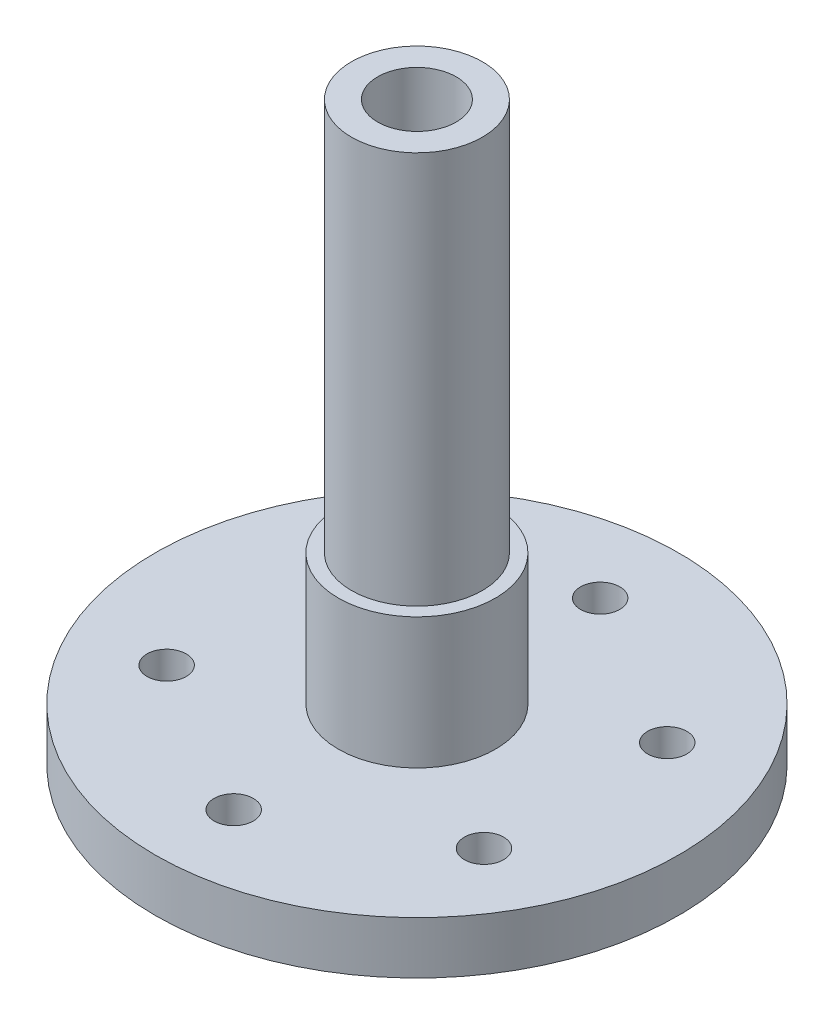
ISO-10303-21;
HEADER;
FILE_DESCRIPTION(('STEP AP214'),'2;1');
FILE_NAME('part.step','',(''),(''),'','','');
FILE_SCHEMA(('AUTOMOTIVE_DESIGN { 1 0 10303 214 1 1 1 1 }'));
ENDSEC;
DATA;
#1=APPLICATION_CONTEXT('core data for automotive mechanical design processes');
#2=APPLICATION_PROTOCOL_DEFINITION('international standard','automotive_design',2000,#1);
#3=PRODUCT_CONTEXT('',#1,'mechanical');
#4=PRODUCT('Part','Part','',(#3));
#5=PRODUCT_RELATED_PRODUCT_CATEGORY('part','',(#4));
#6=PRODUCT_DEFINITION_FORMATION('','',#4);
#7=PRODUCT_DEFINITION_CONTEXT('part definition',#1,'design');
#8=PRODUCT_DEFINITION('design','',#6,#7);
#9=PRODUCT_DEFINITION_SHAPE('','',#8);
#10=(LENGTH_UNIT() NAMED_UNIT(*) SI_UNIT(.MILLI.,.METRE.));
#11=(NAMED_UNIT(*) PLANE_ANGLE_UNIT() SI_UNIT($,.RADIAN.));
#12=(NAMED_UNIT(*) SI_UNIT($,.STERADIAN.) SOLID_ANGLE_UNIT());
#13=UNCERTAINTY_MEASURE_WITH_UNIT(LENGTH_MEASURE(1.E-05),#10,'distance_accuracy_value','');
#14=(GEOMETRIC_REPRESENTATION_CONTEXT(3) GLOBAL_UNCERTAINTY_ASSIGNED_CONTEXT((#13)) GLOBAL_UNIT_ASSIGNED_CONTEXT((#10,
#11,#12)) REPRESENTATION_CONTEXT('',''));
#15=CARTESIAN_POINT('',(0.,0.,0.));
#16=DIRECTION('',(0.,0.,1.));
#17=DIRECTION('',(1.,0.,0.));
#18=AXIS2_PLACEMENT_3D('',#15,#16,#17);
#19=CARTESIAN_POINT('',(0.,4.,0.));
#20=DIRECTION('',(0.,1.,0.));
#21=DIRECTION('',(0.,0.,1.));
#22=AXIS2_PLACEMENT_3D('',#19,#20,#21);
#23=PLANE('',#22);
#24=CARTESIAN_POINT('',(-12.1243556529819,4.,-6.99999999999948));
#25=DIRECTION('',(0.,1.,0.));
#26=DIRECTION('',(0.,0.,1.));
#27=AXIS2_PLACEMENT_3D('',#24,#25,#26);
#28=CIRCLE('',#27,1.5000000000006);
#29=CARTESIAN_POINT('',(-12.1243556529819,4.,-5.49999999999888));
#30=VERTEX_POINT('',#29);
#31=EDGE_CURVE('E59',#30,#30,#28,.T.);
#32=ORIENTED_EDGE('',*,*,#31,.F.);
#33=EDGE_LOOP('',(#32));
#34=FACE_BOUND('',#33,.T.);
#35=CARTESIAN_POINT('',(1.18856827952055E-12,4.,14.));
#36=DIRECTION('',(0.,1.,0.));
#37=DIRECTION('',(0.,0.,1.));
#38=AXIS2_PLACEMENT_3D('',#35,#36,#37);
#39=CIRCLE('',#38,1.50000000000123);
#40=CARTESIAN_POINT('',(1.18856827952055E-12,4.,15.5000000000012));
#41=VERTEX_POINT('',#40);
#42=EDGE_CURVE('E71',#41,#41,#39,.T.);
#43=ORIENTED_EDGE('',*,*,#42,.F.);
#44=EDGE_LOOP('',(#43));
#45=FACE_BOUND('',#44,.T.);
#46=CARTESIAN_POINT('',(12.1243556529824,4.,-7.00000000000052));
#47=DIRECTION('',(0.,1.,0.));
#48=DIRECTION('',(0.,0.,1.));
#49=AXIS2_PLACEMENT_3D('',#46,#47,#48);
#50=CIRCLE('',#49,1.50000000000017);
#51=CARTESIAN_POINT('',(12.1243556529824,4.,-5.50000000000035));
#52=VERTEX_POINT('',#51);
#53=EDGE_CURVE('E83',#52,#52,#50,.T.);
#54=ORIENTED_EDGE('',*,*,#53,.F.);
#55=EDGE_LOOP('',(#54));
#56=FACE_BOUND('',#55,.T.);
#57=CARTESIAN_POINT('',(0.,4.,-14.));
#58=DIRECTION('',(0.,1.,0.));
#59=DIRECTION('',(0.,0.,1.));
#60=AXIS2_PLACEMENT_3D('',#57,#58,#59);
#61=CIRCLE('',#60,1.5);
#62=CARTESIAN_POINT('',(0.,4.,-12.5));
#63=VERTEX_POINT('',#62);
#64=EDGE_CURVE('E92',#63,#63,#61,.T.);
#65=ORIENTED_EDGE('',*,*,#64,.F.);
#66=EDGE_LOOP('',(#65));
#67=FACE_BOUND('',#66,.T.);
#68=CARTESIAN_POINT('',(0.,4.,0.));
#69=DIRECTION('',(0.,1.,0.));
#70=DIRECTION('',(0.,0.,1.));
#71=AXIS2_PLACEMENT_3D('',#68,#69,#70);
#72=CIRCLE('',#71,20.);
#73=CARTESIAN_POINT('',(0.,4.,20.));
#74=VERTEX_POINT('',#73);
#75=EDGE_CURVE('E43',#74,#74,#72,.T.);
#76=ORIENTED_EDGE('',*,*,#75,.T.);
#77=EDGE_LOOP('',(#76));
#78=FACE_BOUND('',#77,.T.);
#79=CARTESIAN_POINT('',(12.124355652983,4.,6.99999999999948));
#80=DIRECTION('',(0.,1.,0.));
#81=DIRECTION('',(0.,0.,1.));
#82=AXIS2_PLACEMENT_3D('',#79,#80,#81);
#83=CIRCLE('',#82,1.50000000000077);
#84=CARTESIAN_POINT('',(12.124355652983,4.,8.50000000000025));
#85=VERTEX_POINT('',#84);
#86=EDGE_CURVE('E77',#85,#85,#83,.T.);
#87=ORIENTED_EDGE('',*,*,#86,.F.);
#88=EDGE_LOOP('',(#87));
#89=FACE_BOUND('',#88,.T.);
#90=CARTESIAN_POINT('',(-12.1243556529812,4.,7.00000000000052));
#91=DIRECTION('',(0.,1.,0.));
#92=DIRECTION('',(0.,0.,1.));
#93=AXIS2_PLACEMENT_3D('',#90,#91,#92);
#94=CIRCLE('',#93,1.50000000000113);
#95=CARTESIAN_POINT('',(-12.1243556529812,4.,8.50000000000166));
#96=VERTEX_POINT('',#95);
#97=EDGE_CURVE('E65',#96,#96,#94,.T.);
#98=ORIENTED_EDGE('',*,*,#97,.F.);
#99=EDGE_LOOP('',(#98));
#100=FACE_BOUND('',#99,.T.);
#101=CARTESIAN_POINT('',(0.,4.,0.));
#102=DIRECTION('',(0.,1.,0.));
#103=DIRECTION('',(0.,0.,1.));
#104=AXIS2_PLACEMENT_3D('',#101,#102,#103);
#105=CIRCLE('',#104,6.);
#106=CARTESIAN_POINT('',(0.,4.,6.));
#107=VERTEX_POINT('',#106);
#108=EDGE_CURVE('E56',#107,#107,#105,.T.);
#109=ORIENTED_EDGE('',*,*,#108,.F.);
#110=EDGE_LOOP('',(#109));
#111=FACE_BOUND('',#110,.T.);
#112=ADVANCED_FACE('F35',(#34,#45,#56,#67,#78,#89,#100,#111),#23,.T.);
#113=CARTESIAN_POINT('',(0.,0.,0.));
#114=DIRECTION('',(0.,1.,0.));
#115=DIRECTION('',(0.,0.,1.));
#116=AXIS2_PLACEMENT_3D('',#113,#114,#115);
#117=PLANE('',#116);
#118=CARTESIAN_POINT('',(0.,0.,0.));
#119=DIRECTION('',(0.,1.,0.));
#120=DIRECTION('',(0.,0.,1.));
#121=AXIS2_PLACEMENT_3D('',#118,#119,#120);
#122=CIRCLE('',#121,20.);
#123=CARTESIAN_POINT('',(0.,0.,20.));
#124=VERTEX_POINT('',#123);
#125=EDGE_CURVE('E39',#124,#124,#122,.T.);
#126=ORIENTED_EDGE('',*,*,#125,.F.);
#127=EDGE_LOOP('',(#126));
#128=FACE_BOUND('',#127,.T.);
#129=CARTESIAN_POINT('',(0.,0.,-14.));
#130=DIRECTION('',(0.,1.,0.));
#131=DIRECTION('',(0.,0.,1.));
#132=AXIS2_PLACEMENT_3D('',#129,#130,#131);
#133=CIRCLE('',#132,1.5);
#134=CARTESIAN_POINT('',(0.,0.,-12.5));
#135=VERTEX_POINT('',#134);
#136=EDGE_CURVE('E91',#135,#135,#133,.T.);
#137=ORIENTED_EDGE('',*,*,#136,.T.);
#138=EDGE_LOOP('',(#137));
#139=FACE_BOUND('',#138,.T.);
#140=CARTESIAN_POINT('',(0.,0.,0.));
#141=DIRECTION('',(0.,1.,0.));
#142=DIRECTION('',(0.,0.,1.));
#143=AXIS2_PLACEMENT_3D('',#140,#141,#142);
#144=CIRCLE('',#143,3.);
#145=CARTESIAN_POINT('',(0.,0.,3.));
#146=VERTEX_POINT('',#145);
#147=EDGE_CURVE('E86',#146,#146,#144,.T.);
#148=ORIENTED_EDGE('',*,*,#147,.T.);
#149=EDGE_LOOP('',(#148));
#150=FACE_BOUND('',#149,.T.);
#151=CARTESIAN_POINT('',(12.1243556529824,0.,-7.00000000000052));
#152=DIRECTION('',(0.,1.,0.));
#153=DIRECTION('',(0.,0.,1.));
#154=AXIS2_PLACEMENT_3D('',#151,#152,#153);
#155=CIRCLE('',#154,1.50000000000017);
#156=CARTESIAN_POINT('',(12.1243556529824,0.,-5.50000000000035));
#157=VERTEX_POINT('',#156);
#158=EDGE_CURVE('E80',#157,#157,#155,.T.);
#159=ORIENTED_EDGE('',*,*,#158,.T.);
#160=EDGE_LOOP('',(#159));
#161=FACE_BOUND('',#160,.T.);
#162=CARTESIAN_POINT('',(12.124355652983,0.,6.99999999999948));
#163=DIRECTION('',(0.,1.,0.));
#164=DIRECTION('',(0.,0.,1.));
#165=AXIS2_PLACEMENT_3D('',#162,#163,#164);
#166=CIRCLE('',#165,1.50000000000077);
#167=CARTESIAN_POINT('',(12.124355652983,0.,8.50000000000025));
#168=VERTEX_POINT('',#167);
#169=EDGE_CURVE('E74',#168,#168,#166,.T.);
#170=ORIENTED_EDGE('',*,*,#169,.T.);
#171=EDGE_LOOP('',(#170));
#172=FACE_BOUND('',#171,.T.);
#173=CARTESIAN_POINT('',(1.18856827952055E-12,0.,14.));
#174=DIRECTION('',(0.,1.,0.));
#175=DIRECTION('',(0.,0.,1.));
#176=AXIS2_PLACEMENT_3D('',#173,#174,#175);
#177=CIRCLE('',#176,1.50000000000123);
#178=CARTESIAN_POINT('',(1.18856827952055E-12,0.,15.5000000000012));
#179=VERTEX_POINT('',#178);
#180=EDGE_CURVE('E68',#179,#179,#177,.T.);
#181=ORIENTED_EDGE('',*,*,#180,.T.);
#182=EDGE_LOOP('',(#181));
#183=FACE_BOUND('',#182,.T.);
#184=CARTESIAN_POINT('',(-12.1243556529812,0.,7.00000000000052));
#185=DIRECTION('',(0.,1.,0.));
#186=DIRECTION('',(0.,0.,1.));
#187=AXIS2_PLACEMENT_3D('',#184,#185,#186);
#188=CIRCLE('',#187,1.50000000000113);
#189=CARTESIAN_POINT('',(-12.1243556529812,0.,8.50000000000166));
#190=VERTEX_POINT('',#189);
#191=EDGE_CURVE('E62',#190,#190,#188,.T.);
#192=ORIENTED_EDGE('',*,*,#191,.T.);
#193=EDGE_LOOP('',(#192));
#194=FACE_BOUND('',#193,.T.);
#195=CARTESIAN_POINT('',(-12.1243556529819,0.,-6.99999999999948));
#196=DIRECTION('',(0.,1.,0.));
#197=DIRECTION('',(0.,0.,1.));
#198=AXIS2_PLACEMENT_3D('',#195,#196,#197);
#199=CIRCLE('',#198,1.5000000000006);
#200=CARTESIAN_POINT('',(-12.1243556529819,0.,-5.49999999999888));
#201=VERTEX_POINT('',#200);
#202=EDGE_CURVE('E55',#201,#201,#199,.T.);
#203=ORIENTED_EDGE('',*,*,#202,.T.);
#204=EDGE_LOOP('',(#203));
#205=FACE_BOUND('',#204,.T.);
#206=ADVANCED_FACE('F98',(#128,#139,#150,#161,#172,#183,#194,#205),#117,.F.);
#207=CARTESIAN_POINT('',(0.,4.,0.));
#208=DIRECTION('',(0.,-1.,0.));
#209=DIRECTION('',(0.,0.,-1.));
#210=AXIS2_PLACEMENT_3D('',#207,#208,#209);
#211=CYLINDRICAL_SURFACE('',#210,20.);
#212=ORIENTED_EDGE('',*,*,#75,.F.);
#213=EDGE_LOOP('',(#212));
#214=FACE_BOUND('',#213,.T.);
#215=ORIENTED_EDGE('',*,*,#125,.T.);
#216=EDGE_LOOP('',(#215));
#217=FACE_BOUND('',#216,.T.);
#218=ADVANCED_FACE('F37',(#214,#217),#211,.T.);
#219=CARTESIAN_POINT('',(0.,4.,-14.));
#220=DIRECTION('',(0.,-1.,0.));
#221=DIRECTION('',(0.,0.,-1.));
#222=AXIS2_PLACEMENT_3D('',#219,#220,#221);
#223=CYLINDRICAL_SURFACE('',#222,1.5);
#224=ORIENTED_EDGE('',*,*,#64,.T.);
#225=EDGE_LOOP('',(#224));
#226=FACE_BOUND('',#225,.T.);
#227=ORIENTED_EDGE('',*,*,#136,.F.);
#228=EDGE_LOOP('',(#227));
#229=FACE_BOUND('',#228,.T.);
#230=ADVANCED_FACE('F101',(#226,#229),#223,.F.);
#231=CARTESIAN_POINT('',(0.,4.,0.));
#232=DIRECTION('',(0.,-1.,0.));
#233=DIRECTION('',(0.,0.,-1.));
#234=AXIS2_PLACEMENT_3D('',#231,#232,#233);
#235=CYLINDRICAL_SURFACE('',#234,3.);
#236=ORIENTED_EDGE('',*,*,#147,.F.);
#237=EDGE_LOOP('',(#236));
#238=FACE_BOUND('',#237,.T.);
#239=CARTESIAN_POINT('',(0.,44.,0.));
#240=DIRECTION('',(0.,1.,0.));
#241=DIRECTION('',(0.,0.,1.));
#242=AXIS2_PLACEMENT_3D('',#239,#240,#241);
#243=CIRCLE('',#242,3.);
#244=CARTESIAN_POINT('',(0.,44.,3.));
#245=VERTEX_POINT('',#244);
#246=EDGE_CURVE('E236',#245,#245,#243,.T.);
#247=ORIENTED_EDGE('',*,*,#246,.T.);
#248=EDGE_LOOP('',(#247));
#249=FACE_BOUND('',#248,.T.);
#250=ADVANCED_FACE('F103',(#238,#249),#235,.F.);
#251=CARTESIAN_POINT('',(12.1243556529824,4.,-7.00000000000052));
#252=DIRECTION('',(0.,-1.,0.));
#253=DIRECTION('',(0.,0.,-1.));
#254=AXIS2_PLACEMENT_3D('',#251,#252,#253);
#255=CYLINDRICAL_SURFACE('',#254,1.50000000000017);
#256=ORIENTED_EDGE('',*,*,#53,.T.);
#257=EDGE_LOOP('',(#256));
#258=FACE_BOUND('',#257,.T.);
#259=ORIENTED_EDGE('',*,*,#158,.F.);
#260=EDGE_LOOP('',(#259));
#261=FACE_BOUND('',#260,.T.);
#262=ADVANCED_FACE('F110',(#258,#261),#255,.F.);
#263=CARTESIAN_POINT('',(12.124355652983,4.,6.99999999999948));
#264=DIRECTION('',(0.,-1.,0.));
#265=DIRECTION('',(0.,0.,-1.));
#266=AXIS2_PLACEMENT_3D('',#263,#264,#265);
#267=CYLINDRICAL_SURFACE('',#266,1.50000000000077);
#268=ORIENTED_EDGE('',*,*,#86,.T.);
#269=EDGE_LOOP('',(#268));
#270=FACE_BOUND('',#269,.T.);
#271=ORIENTED_EDGE('',*,*,#169,.F.);
#272=EDGE_LOOP('',(#271));
#273=FACE_BOUND('',#272,.T.);
#274=ADVANCED_FACE('F166',(#270,#273),#267,.F.);
#275=CARTESIAN_POINT('',(1.18856827952055E-12,4.,14.));
#276=DIRECTION('',(0.,-1.,0.));
#277=DIRECTION('',(0.,0.,-1.));
#278=AXIS2_PLACEMENT_3D('',#275,#276,#277);
#279=CYLINDRICAL_SURFACE('',#278,1.50000000000123);
#280=ORIENTED_EDGE('',*,*,#42,.T.);
#281=EDGE_LOOP('',(#280));
#282=FACE_BOUND('',#281,.T.);
#283=ORIENTED_EDGE('',*,*,#180,.F.);
#284=EDGE_LOOP('',(#283));
#285=FACE_BOUND('',#284,.T.);
#286=ADVANCED_FACE('F162',(#282,#285),#279,.F.);
#287=CARTESIAN_POINT('',(-12.1243556529812,4.,7.00000000000052));
#288=DIRECTION('',(0.,-1.,0.));
#289=DIRECTION('',(0.,0.,-1.));
#290=AXIS2_PLACEMENT_3D('',#287,#288,#289);
#291=CYLINDRICAL_SURFACE('',#290,1.50000000000113);
#292=ORIENTED_EDGE('',*,*,#97,.T.);
#293=EDGE_LOOP('',(#292));
#294=FACE_BOUND('',#293,.T.);
#295=ORIENTED_EDGE('',*,*,#191,.F.);
#296=EDGE_LOOP('',(#295));
#297=FACE_BOUND('',#296,.T.);
#298=ADVANCED_FACE('F158',(#294,#297),#291,.F.);
#299=CARTESIAN_POINT('',(-12.1243556529819,4.,-6.99999999999948));
#300=DIRECTION('',(0.,-1.,0.));
#301=DIRECTION('',(0.,0.,-1.));
#302=AXIS2_PLACEMENT_3D('',#299,#300,#301);
#303=CYLINDRICAL_SURFACE('',#302,1.5000000000006);
#304=ORIENTED_EDGE('',*,*,#31,.T.);
#305=EDGE_LOOP('',(#304));
#306=FACE_BOUND('',#305,.T.);
#307=ORIENTED_EDGE('',*,*,#202,.F.);
#308=EDGE_LOOP('',(#307));
#309=FACE_BOUND('',#308,.T.);
#310=ADVANCED_FACE('F150',(#306,#309),#303,.F.);
#311=CARTESIAN_POINT('',(0.,14.,0.));
#312=DIRECTION('',(0.,1.,0.));
#313=DIRECTION('',(0.,0.,1.));
#314=AXIS2_PLACEMENT_3D('',#311,#312,#313);
#315=PLANE('',#314);
#316=CARTESIAN_POINT('',(0.,14.,0.));
#317=DIRECTION('',(0.,1.,0.));
#318=DIRECTION('',(0.,0.,1.));
#319=AXIS2_PLACEMENT_3D('',#316,#317,#318);
#320=CIRCLE('',#319,5.);
#321=CARTESIAN_POINT('',(0.,14.,5.));
#322=VERTEX_POINT('',#321);
#323=EDGE_CURVE('E10',#322,#322,#320,.T.);
#324=ORIENTED_EDGE('',*,*,#323,.F.);
#325=EDGE_LOOP('',(#324));
#326=FACE_BOUND('',#325,.T.);
#327=CARTESIAN_POINT('',(0.,14.,0.));
#328=DIRECTION('',(0.,1.,0.));
#329=DIRECTION('',(0.,0.,1.));
#330=AXIS2_PLACEMENT_3D('',#327,#328,#329);
#331=CIRCLE('',#330,6.);
#332=CARTESIAN_POINT('',(0.,14.,6.));
#333=VERTEX_POINT('',#332);
#334=EDGE_CURVE('E52',#333,#333,#331,.T.);
#335=ORIENTED_EDGE('',*,*,#334,.T.);
#336=EDGE_LOOP('',(#335));
#337=FACE_BOUND('',#336,.T.);
#338=ADVANCED_FACE('F140',(#326,#337),#315,.T.);
#339=CARTESIAN_POINT('',(0.,14.,0.));
#340=DIRECTION('',(0.,-1.,0.));
#341=DIRECTION('',(0.,0.,-1.));
#342=AXIS2_PLACEMENT_3D('',#339,#340,#341);
#343=CYLINDRICAL_SURFACE('',#342,6.);
#344=ORIENTED_EDGE('',*,*,#334,.F.);
#345=EDGE_LOOP('',(#344));
#346=FACE_BOUND('',#345,.T.);
#347=ORIENTED_EDGE('',*,*,#108,.T.);
#348=EDGE_LOOP('',(#347));
#349=FACE_BOUND('',#348,.T.);
#350=ADVANCED_FACE('F137',(#346,#349),#343,.T.);
#351=CARTESIAN_POINT('',(0.,44.,0.));
#352=DIRECTION('',(0.,1.,0.));
#353=DIRECTION('',(0.,0.,1.));
#354=AXIS2_PLACEMENT_3D('',#351,#352,#353);
#355=PLANE('',#354);
#356=CARTESIAN_POINT('',(0.,44.,0.));
#357=DIRECTION('',(0.,1.,0.));
#358=DIRECTION('',(0.,0.,1.));
#359=AXIS2_PLACEMENT_3D('',#356,#357,#358);
#360=CIRCLE('',#359,5.);
#361=CARTESIAN_POINT('',(0.,44.,5.));
#362=VERTEX_POINT('',#361);
#363=EDGE_CURVE('E50',#362,#362,#360,.T.);
#364=ORIENTED_EDGE('',*,*,#363,.T.);
#365=EDGE_LOOP('',(#364));
#366=FACE_BOUND('',#365,.T.);
#367=ORIENTED_EDGE('',*,*,#246,.F.);
#368=EDGE_LOOP('',(#367));
#369=FACE_BOUND('',#368,.T.);
#370=ADVANCED_FACE('F139',(#366,#369),#355,.T.);
#371=CARTESIAN_POINT('',(0.,44.,0.));
#372=DIRECTION('',(0.,-1.,0.));
#373=DIRECTION('',(0.,0.,-1.));
#374=AXIS2_PLACEMENT_3D('',#371,#372,#373);
#375=CYLINDRICAL_SURFACE('',#374,5.);
#376=ORIENTED_EDGE('',*,*,#363,.F.);
#377=EDGE_LOOP('',(#376));
#378=FACE_BOUND('',#377,.T.);
#379=ORIENTED_EDGE('',*,*,#323,.T.);
#380=EDGE_LOOP('',(#379));
#381=FACE_BOUND('',#380,.T.);
#382=ADVANCED_FACE('F147',(#378,#381),#375,.T.);
#383=CLOSED_SHELL('',(#112,#206,#218,#230,#250,#262,#274,#286,#298,#310,#338,#350,#370,#382));
#384=MANIFOLD_SOLID_BREP('B2',#383);
#385=ADVANCED_BREP_SHAPE_REPRESENTATION('',(#18,#384),#14);
#386=SHAPE_DEFINITION_REPRESENTATION(#9,#385);
ENDSEC;
END-ISO-10303-21;
